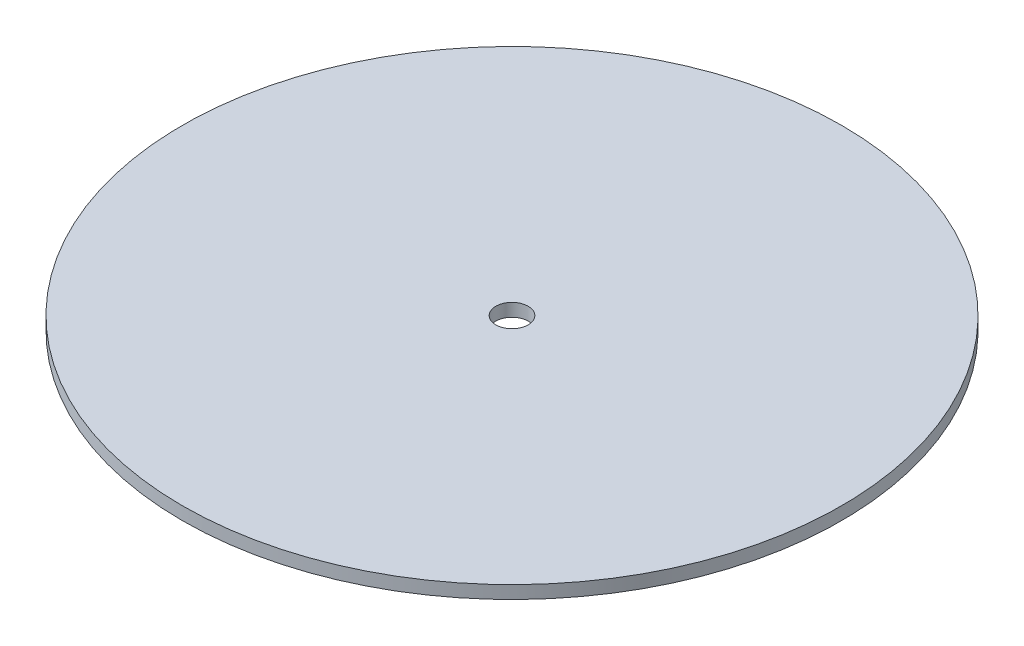
ISO-10303-21;
HEADER;
FILE_DESCRIPTION(('STEP AP214'),'2;1');
FILE_NAME('part.step','',(''),(''),'','','');
FILE_SCHEMA(('AUTOMOTIVE_DESIGN { 1 0 10303 214 1 1 1 1 }'));
ENDSEC;
DATA;
#1=APPLICATION_CONTEXT('core data for automotive mechanical design processes');
#2=APPLICATION_PROTOCOL_DEFINITION('international standard','automotive_design',2000,#1);
#3=PRODUCT_CONTEXT('',#1,'mechanical');
#4=PRODUCT('Part','Part','',(#3));
#5=PRODUCT_RELATED_PRODUCT_CATEGORY('part','',(#4));
#6=PRODUCT_DEFINITION_FORMATION('','',#4);
#7=PRODUCT_DEFINITION_CONTEXT('part definition',#1,'design');
#8=PRODUCT_DEFINITION('design','',#6,#7);
#9=PRODUCT_DEFINITION_SHAPE('','',#8);
#10=(LENGTH_UNIT() NAMED_UNIT(*) SI_UNIT(.MILLI.,.METRE.));
#11=(NAMED_UNIT(*) PLANE_ANGLE_UNIT() SI_UNIT($,.RADIAN.));
#12=(NAMED_UNIT(*) SI_UNIT($,.STERADIAN.) SOLID_ANGLE_UNIT());
#13=UNCERTAINTY_MEASURE_WITH_UNIT(LENGTH_MEASURE(1.E-05),#10,'distance_accuracy_value','');
#14=(GEOMETRIC_REPRESENTATION_CONTEXT(3) GLOBAL_UNCERTAINTY_ASSIGNED_CONTEXT((#13)) GLOBAL_UNIT_ASSIGNED_CONTEXT((#10,
#11,#12)) REPRESENTATION_CONTEXT('',''));
#15=CARTESIAN_POINT('',(0.,0.,0.));
#16=DIRECTION('',(0.,0.,1.));
#17=DIRECTION('',(1.,0.,0.));
#18=AXIS2_PLACEMENT_3D('',#15,#16,#17);
#19=CARTESIAN_POINT('',(0.,4.,0.));
#20=DIRECTION('',(0.,1.,0.));
#21=DIRECTION('',(0.,0.,1.));
#22=AXIS2_PLACEMENT_3D('',#19,#20,#21);
#23=PLANE('',#22);
#24=CARTESIAN_POINT('',(0.,4.,0.));
#25=DIRECTION('',(0.,1.,0.));
#26=DIRECTION('',(0.,0.,1.));
#27=AXIS2_PLACEMENT_3D('',#24,#25,#26);
#28=CIRCLE('',#27,102.);
#29=CARTESIAN_POINT('',(0.,4.,102.));
#30=VERTEX_POINT('',#29);
#31=EDGE_CURVE('E10',#30,#30,#28,.T.);
#32=ORIENTED_EDGE('',*,*,#31,.T.);
#33=EDGE_LOOP('',(#32));
#34=FACE_BOUND('',#33,.T.);
#35=CARTESIAN_POINT('',(0.,4.,0.));
#36=DIRECTION('',(0.,1.,0.));
#37=DIRECTION('',(0.,0.,1.));
#38=AXIS2_PLACEMENT_3D('',#35,#36,#37);
#39=CIRCLE('',#38,5.);
#40=CARTESIAN_POINT('',(0.,4.,5.));
#41=VERTEX_POINT('',#40);
#42=EDGE_CURVE('E54',#41,#41,#39,.T.);
#43=ORIENTED_EDGE('',*,*,#42,.F.);
#44=EDGE_LOOP('',(#43));
#45=FACE_BOUND('',#44,.T.);
#46=ADVANCED_FACE('F41',(#34,#45),#23,.T.);
#47=CARTESIAN_POINT('',(0.,0.,0.));
#48=DIRECTION('',(0.,1.,0.));
#49=DIRECTION('',(0.,0.,1.));
#50=AXIS2_PLACEMENT_3D('',#47,#48,#49);
#51=PLANE('',#50);
#52=CARTESIAN_POINT('',(0.,0.,0.));
#53=DIRECTION('',(0.,1.,0.));
#54=DIRECTION('',(0.,0.,1.));
#55=AXIS2_PLACEMENT_3D('',#52,#53,#54);
#56=CIRCLE('',#55,102.);
#57=CARTESIAN_POINT('',(0.,0.,102.));
#58=VERTEX_POINT('',#57);
#59=EDGE_CURVE('E45',#58,#58,#56,.T.);
#60=ORIENTED_EDGE('',*,*,#59,.F.);
#61=EDGE_LOOP('',(#60));
#62=FACE_BOUND('',#61,.T.);
#63=CARTESIAN_POINT('',(0.,0.,0.));
#64=DIRECTION('',(0.,1.,0.));
#65=DIRECTION('',(0.,0.,1.));
#66=AXIS2_PLACEMENT_3D('',#63,#64,#65);
#67=CIRCLE('',#66,5.);
#68=CARTESIAN_POINT('',(0.,0.,5.));
#69=VERTEX_POINT('',#68);
#70=EDGE_CURVE('E56',#69,#69,#67,.T.);
#71=ORIENTED_EDGE('',*,*,#70,.T.);
#72=EDGE_LOOP('',(#71));
#73=FACE_BOUND('',#72,.T.);
#74=ADVANCED_FACE('F68',(#62,#73),#51,.F.);
#75=CARTESIAN_POINT('',(0.,4.,0.));
#76=DIRECTION('',(0.,-1.,0.));
#77=DIRECTION('',(0.,0.,-1.));
#78=AXIS2_PLACEMENT_3D('',#75,#76,#77);
#79=CYLINDRICAL_SURFACE('',#78,102.);
#80=ORIENTED_EDGE('',*,*,#31,.F.);
#81=EDGE_LOOP('',(#80));
#82=FACE_BOUND('',#81,.T.);
#83=ORIENTED_EDGE('',*,*,#59,.T.);
#84=EDGE_LOOP('',(#83));
#85=FACE_BOUND('',#84,.T.);
#86=ADVANCED_FACE('F43',(#82,#85),#79,.T.);
#87=CARTESIAN_POINT('',(0.,4.,0.));
#88=DIRECTION('',(0.,-1.,0.));
#89=DIRECTION('',(0.,0.,-1.));
#90=AXIS2_PLACEMENT_3D('',#87,#88,#89);
#91=CYLINDRICAL_SURFACE('',#90,5.);
#92=ORIENTED_EDGE('',*,*,#42,.T.);
#93=EDGE_LOOP('',(#92));
#94=FACE_BOUND('',#93,.T.);
#95=ORIENTED_EDGE('',*,*,#70,.F.);
#96=EDGE_LOOP('',(#95));
#97=FACE_BOUND('',#96,.T.);
#98=ADVANCED_FACE('F64',(#94,#97),#91,.F.);
#99=CLOSED_SHELL('',(#46,#74,#86,#98));
#100=MANIFOLD_SOLID_BREP('B2',#99);
#101=ADVANCED_BREP_SHAPE_REPRESENTATION('',(#18,#100),#14);
#102=SHAPE_DEFINITION_REPRESENTATION(#9,#101);
ENDSEC;
END-ISO-10303-21;
